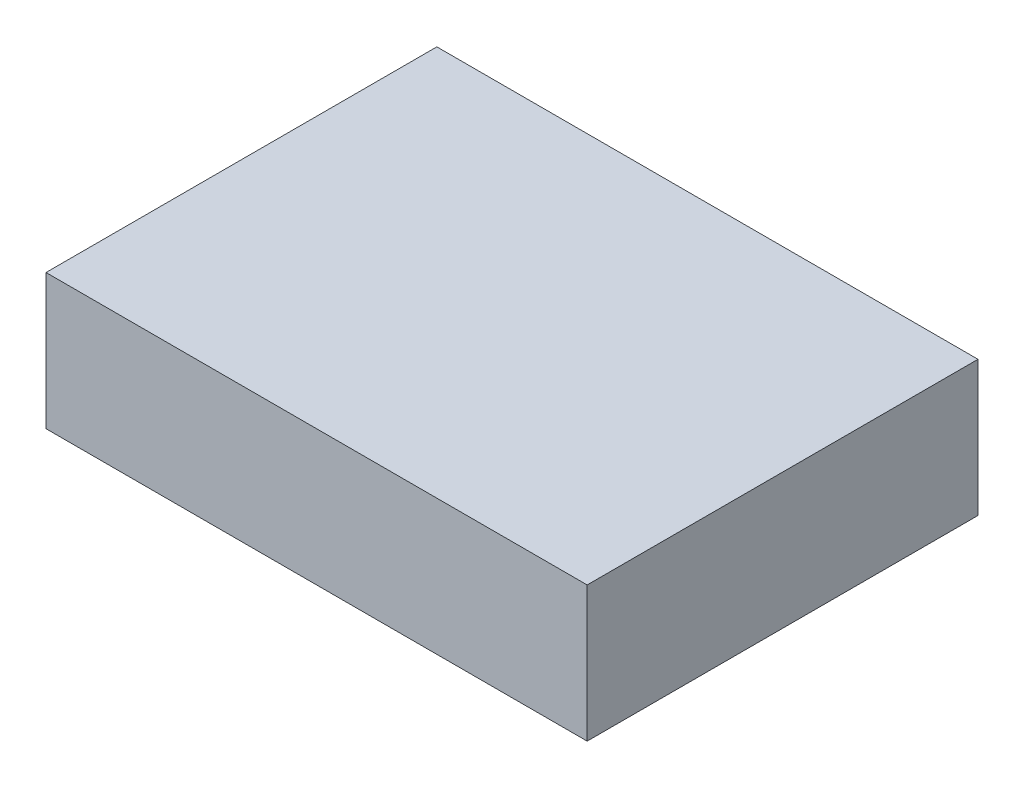
ISO-10303-21;
HEADER;
FILE_DESCRIPTION(('STEP AP214'),'2;1');
FILE_NAME('part.step','',(''),(''),'','','');
FILE_SCHEMA(('AUTOMOTIVE_DESIGN { 1 0 10303 214 1 1 1 1 }'));
ENDSEC;
DATA;
#1=APPLICATION_CONTEXT('core data for automotive mechanical design processes');
#2=APPLICATION_PROTOCOL_DEFINITION('international standard','automotive_design',2000,#1);
#3=PRODUCT_CONTEXT('',#1,'mechanical');
#4=PRODUCT('Part','Part','',(#3));
#5=PRODUCT_RELATED_PRODUCT_CATEGORY('part','',(#4));
#6=PRODUCT_DEFINITION_FORMATION('','',#4);
#7=PRODUCT_DEFINITION_CONTEXT('part definition',#1,'design');
#8=PRODUCT_DEFINITION('design','',#6,#7);
#9=PRODUCT_DEFINITION_SHAPE('','',#8);
#10=(LENGTH_UNIT() NAMED_UNIT(*) SI_UNIT(.MILLI.,.METRE.));
#11=(NAMED_UNIT(*) PLANE_ANGLE_UNIT() SI_UNIT($,.RADIAN.));
#12=(NAMED_UNIT(*) SI_UNIT($,.STERADIAN.) SOLID_ANGLE_UNIT());
#13=UNCERTAINTY_MEASURE_WITH_UNIT(LENGTH_MEASURE(1.E-05),#10,'distance_accuracy_value','');
#14=(GEOMETRIC_REPRESENTATION_CONTEXT(3) GLOBAL_UNCERTAINTY_ASSIGNED_CONTEXT((#13)) GLOBAL_UNIT_ASSIGNED_CONTEXT((#10,
#11,#12)) REPRESENTATION_CONTEXT('',''));
#15=CARTESIAN_POINT('',(0.,0.,0.));
#16=DIRECTION('',(0.,0.,1.));
#17=DIRECTION('',(1.,0.,0.));
#18=AXIS2_PLACEMENT_3D('',#15,#16,#17);
#19=CARTESIAN_POINT('',(18.,9.,-13.));
#20=DIRECTION('',(-1.,0.,0.));
#21=DIRECTION('',(0.,0.,1.));
#22=AXIS2_PLACEMENT_3D('',#19,#20,#21);
#23=PLANE('',#22);
#24=DIRECTION('',(0.,0.,-1.));
#25=VECTOR('',#24,1.);
#26=CARTESIAN_POINT('',(18.,0.,-13.));
#27=LINE('',#26,#25);
#28=CARTESIAN_POINT('',(18.,0.,13.));
#29=VERTEX_POINT('',#28);
#30=CARTESIAN_POINT('',(18.,0.,-13.));
#31=VERTEX_POINT('',#30);
#32=EDGE_CURVE('E102',#29,#31,#27,.T.);
#33=ORIENTED_EDGE('',*,*,#32,.T.);
#34=DIRECTION('',(0.,-1.,0.));
#35=VECTOR('',#34,1.);
#36=CARTESIAN_POINT('',(18.,9.,-13.));
#37=LINE('',#36,#35);
#38=CARTESIAN_POINT('',(18.,9.,-13.));
#39=VERTEX_POINT('',#38);
#40=EDGE_CURVE('E11',#39,#31,#37,.T.);
#41=ORIENTED_EDGE('',*,*,#40,.F.);
#42=DIRECTION('',(0.,0.,-1.));
#43=VECTOR('',#42,1.);
#44=CARTESIAN_POINT('',(18.,9.,-13.));
#45=LINE('',#44,#43);
#46=CARTESIAN_POINT('',(18.,9.,13.));
#47=VERTEX_POINT('',#46);
#48=EDGE_CURVE('E95',#47,#39,#45,.T.);
#49=ORIENTED_EDGE('',*,*,#48,.F.);
#50=DIRECTION('',(0.,-1.,0.));
#51=VECTOR('',#50,1.);
#52=CARTESIAN_POINT('',(18.,9.,13.));
#53=LINE('',#52,#51);
#54=EDGE_CURVE('E99',#47,#29,#53,.T.);
#55=ORIENTED_EDGE('',*,*,#54,.T.);
#56=EDGE_LOOP('',(#33,#41,#49,#55));
#57=FACE_BOUND('',#56,.T.);
#58=ADVANCED_FACE('F41',(#57),#23,.F.);
#59=CARTESIAN_POINT('',(-18.,9.,-13.));
#60=DIRECTION('',(0.,0.,1.));
#61=DIRECTION('',(1.,0.,0.));
#62=AXIS2_PLACEMENT_3D('',#59,#60,#61);
#63=PLANE('',#62);
#64=DIRECTION('',(-1.,0.,0.));
#65=VECTOR('',#64,1.);
#66=CARTESIAN_POINT('',(-18.,0.,-13.));
#67=LINE('',#66,#65);
#68=CARTESIAN_POINT('',(-18.,0.,-13.));
#69=VERTEX_POINT('',#68);
#70=EDGE_CURVE('E96',#31,#69,#67,.T.);
#71=ORIENTED_EDGE('',*,*,#70,.T.);
#72=DIRECTION('',(0.,-1.,0.));
#73=VECTOR('',#72,1.);
#74=CARTESIAN_POINT('',(-18.,9.,-13.));
#75=LINE('',#74,#73);
#76=CARTESIAN_POINT('',(-18.,9.,-13.));
#77=VERTEX_POINT('',#76);
#78=EDGE_CURVE('E47',#77,#69,#75,.T.);
#79=ORIENTED_EDGE('',*,*,#78,.F.);
#80=DIRECTION('',(-1.,0.,0.));
#81=VECTOR('',#80,1.);
#82=CARTESIAN_POINT('',(-18.,9.,-13.));
#83=LINE('',#82,#81);
#84=EDGE_CURVE('E87',#39,#77,#83,.T.);
#85=ORIENTED_EDGE('',*,*,#84,.F.);
#86=ORIENTED_EDGE('',*,*,#40,.T.);
#87=EDGE_LOOP('',(#71,#79,#85,#86));
#88=FACE_BOUND('',#87,.T.);
#89=ADVANCED_FACE('F92',(#88),#63,.F.);
#90=CARTESIAN_POINT('',(-18.,9.,-13.));
#91=DIRECTION('',(1.,0.,0.));
#92=DIRECTION('',(0.,0.,-1.));
#93=AXIS2_PLACEMENT_3D('',#90,#91,#92);
#94=PLANE('',#93);
#95=DIRECTION('',(0.,0.,1.));
#96=VECTOR('',#95,1.);
#97=CARTESIAN_POINT('',(-18.,0.,-13.));
#98=LINE('',#97,#96);
#99=CARTESIAN_POINT('',(-18.,0.,13.));
#100=VERTEX_POINT('',#99);
#101=EDGE_CURVE('E74',#69,#100,#98,.T.);
#102=ORIENTED_EDGE('',*,*,#101,.T.);
#103=DIRECTION('',(0.,-1.,0.));
#104=VECTOR('',#103,1.);
#105=CARTESIAN_POINT('',(-18.,9.,13.));
#106=LINE('',#105,#104);
#107=CARTESIAN_POINT('',(-18.,9.,13.));
#108=VERTEX_POINT('',#107);
#109=EDGE_CURVE('E100',#108,#100,#106,.T.);
#110=ORIENTED_EDGE('',*,*,#109,.F.);
#111=DIRECTION('',(0.,0.,1.));
#112=VECTOR('',#111,1.);
#113=CARTESIAN_POINT('',(-18.,9.,-13.));
#114=LINE('',#113,#112);
#115=EDGE_CURVE('E89',#77,#108,#114,.T.);
#116=ORIENTED_EDGE('',*,*,#115,.F.);
#117=ORIENTED_EDGE('',*,*,#78,.T.);
#118=EDGE_LOOP('',(#102,#110,#116,#117));
#119=FACE_BOUND('',#118,.T.);
#120=ADVANCED_FACE('F98',(#119),#94,.F.);
#121=CARTESIAN_POINT('',(-18.,9.,13.));
#122=DIRECTION('',(0.,0.,-1.));
#123=DIRECTION('',(-1.,0.,0.));
#124=AXIS2_PLACEMENT_3D('',#121,#122,#123);
#125=PLANE('',#124);
#126=DIRECTION('',(1.,0.,0.));
#127=VECTOR('',#126,1.);
#128=CARTESIAN_POINT('',(-18.,0.,13.));
#129=LINE('',#128,#127);
#130=EDGE_CURVE('E79',#100,#29,#129,.T.);
#131=ORIENTED_EDGE('',*,*,#130,.T.);
#132=ORIENTED_EDGE('',*,*,#54,.F.);
#133=DIRECTION('',(1.,0.,0.));
#134=VECTOR('',#133,1.);
#135=CARTESIAN_POINT('',(-18.,9.,13.));
#136=LINE('',#135,#134);
#137=EDGE_CURVE('E60',#108,#47,#136,.T.);
#138=ORIENTED_EDGE('',*,*,#137,.F.);
#139=ORIENTED_EDGE('',*,*,#109,.T.);
#140=EDGE_LOOP('',(#131,#132,#138,#139));
#141=FACE_BOUND('',#140,.T.);
#142=ADVANCED_FACE('F112',(#141),#125,.F.);
#143=CARTESIAN_POINT('',(0.,9.,0.));
#144=DIRECTION('',(0.,1.,0.));
#145=DIRECTION('',(0.,0.,1.));
#146=AXIS2_PLACEMENT_3D('',#143,#144,#145);
#147=PLANE('',#146);
#148=ORIENTED_EDGE('',*,*,#48,.T.);
#149=ORIENTED_EDGE('',*,*,#84,.T.);
#150=ORIENTED_EDGE('',*,*,#115,.T.);
#151=ORIENTED_EDGE('',*,*,#137,.T.);
#152=EDGE_LOOP('',(#148,#149,#150,#151));
#153=FACE_BOUND('',#152,.T.);
#154=ADVANCED_FACE('F86',(#153),#147,.T.);
#155=CARTESIAN_POINT('',(0.,0.,0.));
#156=DIRECTION('',(0.,1.,0.));
#157=DIRECTION('',(0.,0.,1.));
#158=AXIS2_PLACEMENT_3D('',#155,#156,#157);
#159=PLANE('',#158);
#160=ORIENTED_EDGE('',*,*,#32,.F.);
#161=ORIENTED_EDGE('',*,*,#130,.F.);
#162=ORIENTED_EDGE('',*,*,#101,.F.);
#163=ORIENTED_EDGE('',*,*,#70,.F.);
#164=EDGE_LOOP('',(#160,#161,#162,#163));
#165=FACE_BOUND('',#164,.T.);
#166=ADVANCED_FACE('F111',(#165),#159,.F.);
#167=CLOSED_SHELL('',(#58,#89,#120,#142,#154,#166));
#168=MANIFOLD_SOLID_BREP('B2',#167);
#169=ADVANCED_BREP_SHAPE_REPRESENTATION('',(#18,#168),#14);
#170=SHAPE_DEFINITION_REPRESENTATION(#9,#169);
ENDSEC;
END-ISO-10303-21;
